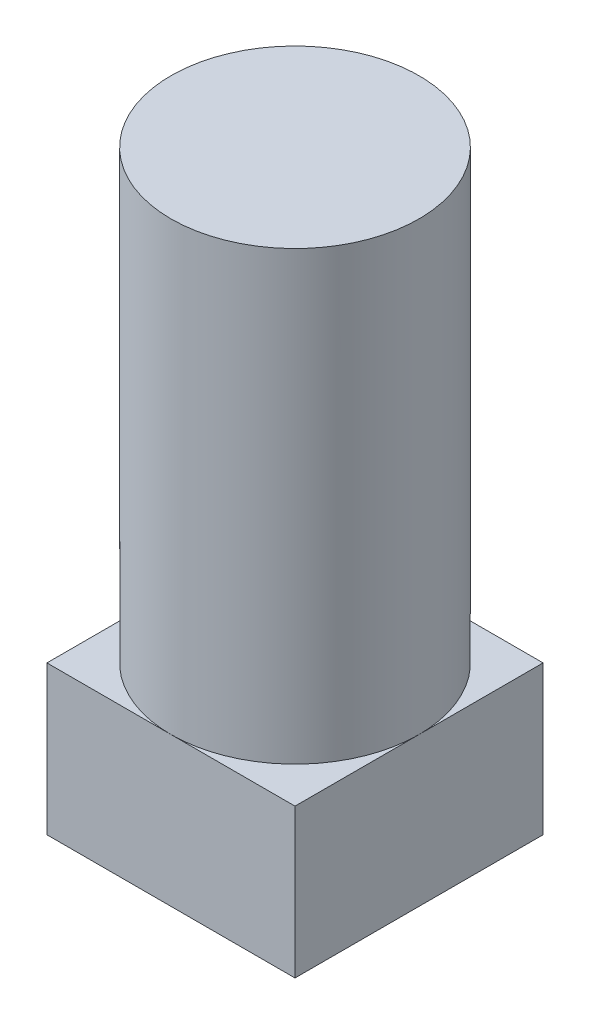
ISO-10303-21;
HEADER;
FILE_DESCRIPTION(('STEP AP214'),'2;1');
FILE_NAME('part.step','',(''),(''),'','','');
FILE_SCHEMA(('AUTOMOTIVE_DESIGN { 1 0 10303 214 1 1 1 1 }'));
ENDSEC;
DATA;
#1=APPLICATION_CONTEXT('core data for automotive mechanical design processes');
#2=APPLICATION_PROTOCOL_DEFINITION('international standard','automotive_design',2000,#1);
#3=PRODUCT_CONTEXT('',#1,'mechanical');
#4=PRODUCT('Part','Part','',(#3));
#5=PRODUCT_RELATED_PRODUCT_CATEGORY('part','',(#4));
#6=PRODUCT_DEFINITION_FORMATION('','',#4);
#7=PRODUCT_DEFINITION_CONTEXT('part definition',#1,'design');
#8=PRODUCT_DEFINITION('design','',#6,#7);
#9=PRODUCT_DEFINITION_SHAPE('','',#8);
#10=(LENGTH_UNIT() NAMED_UNIT(*) SI_UNIT(.MILLI.,.METRE.));
#11=(NAMED_UNIT(*) PLANE_ANGLE_UNIT() SI_UNIT($,.RADIAN.));
#12=(NAMED_UNIT(*) SI_UNIT($,.STERADIAN.) SOLID_ANGLE_UNIT());
#13=UNCERTAINTY_MEASURE_WITH_UNIT(LENGTH_MEASURE(1.E-05),#10,'distance_accuracy_value','');
#14=(GEOMETRIC_REPRESENTATION_CONTEXT(3) GLOBAL_UNCERTAINTY_ASSIGNED_CONTEXT((#13)) GLOBAL_UNIT_ASSIGNED_CONTEXT((#10,
#11,#12)) REPRESENTATION_CONTEXT('',''));
#15=CARTESIAN_POINT('',(0.,0.,0.));
#16=DIRECTION('',(0.,0.,1.));
#17=DIRECTION('',(1.,0.,0.));
#18=AXIS2_PLACEMENT_3D('',#15,#16,#17);
#19=CARTESIAN_POINT('',(0.,152.4,0.));
#20=DIRECTION('',(0.,1.,0.));
#21=DIRECTION('',(0.,0.,1.));
#22=AXIS2_PLACEMENT_3D('',#19,#20,#21);
#23=PLANE('',#22);
#24=CARTESIAN_POINT('',(0.,152.4,0.));
#25=DIRECTION('',(0.,1.,0.));
#26=DIRECTION('',(0.,0.,1.));
#27=AXIS2_PLACEMENT_3D('',#24,#25,#26);
#28=CIRCLE('',#27,127.);
#29=CARTESIAN_POINT('',(0.,152.4,127.));
#30=VERTEX_POINT('',#29);
#31=CARTESIAN_POINT('',(127.,152.4,0.));
#32=VERTEX_POINT('',#31);
#33=EDGE_CURVE('E44',#30,#32,#28,.T.);
#34=ORIENTED_EDGE('',*,*,#33,.F.);
#35=DIRECTION('',(1.,0.,0.));
#36=VECTOR('',#35,1.);
#37=CARTESIAN_POINT('',(-127.,152.4,127.));
#38=LINE('',#37,#36);
#39=CARTESIAN_POINT('',(127.,152.4,127.));
#40=VERTEX_POINT('',#39);
#41=EDGE_CURVE('E94',#30,#40,#38,.T.);
#42=ORIENTED_EDGE('',*,*,#41,.T.);
#43=DIRECTION('',(0.,0.,-1.));
#44=VECTOR('',#43,1.);
#45=CARTESIAN_POINT('',(127.,152.4,127.));
#46=LINE('',#45,#44);
#47=EDGE_CURVE('E104',#40,#32,#46,.T.);
#48=ORIENTED_EDGE('',*,*,#47,.T.);
#49=EDGE_LOOP('',(#34,#42,#48));
#50=FACE_BOUND('',#49,.T.);
#51=ADVANCED_FACE('F33',(#50),#23,.T.);
#52=CARTESIAN_POINT('',(0.,152.4,-127.));
#53=VERTEX_POINT('',#52);
#54=EDGE_CURVE('E11',#32,#53,#28,.T.);
#55=ORIENTED_EDGE('',*,*,#54,.F.);
#56=CARTESIAN_POINT('',(127.,152.4,-127.));
#57=VERTEX_POINT('',#56);
#58=EDGE_CURVE('E118',#32,#57,#46,.T.);
#59=ORIENTED_EDGE('',*,*,#58,.T.);
#60=DIRECTION('',(1.,0.,0.));
#61=VECTOR('',#60,1.);
#62=CARTESIAN_POINT('',(-127.,152.4,-127.));
#63=LINE('',#62,#61);
#64=EDGE_CURVE('E119',#53,#57,#63,.T.);
#65=ORIENTED_EDGE('',*,*,#64,.F.);
#66=EDGE_LOOP('',(#55,#59,#65));
#67=FACE_BOUND('',#66,.T.);
#68=ADVANCED_FACE('F150',(#67),#23,.T.);
#69=CARTESIAN_POINT('',(-127.,152.4,0.));
#70=VERTEX_POINT('',#69);
#71=EDGE_CURVE('E42',#53,#70,#28,.T.);
#72=ORIENTED_EDGE('',*,*,#71,.F.);
#73=CARTESIAN_POINT('',(-127.,152.4,-127.));
#74=VERTEX_POINT('',#73);
#75=EDGE_CURVE('E115',#74,#53,#63,.T.);
#76=ORIENTED_EDGE('',*,*,#75,.F.);
#77=DIRECTION('',(0.,0.,-1.));
#78=VECTOR('',#77,1.);
#79=CARTESIAN_POINT('',(-127.,152.4,127.));
#80=LINE('',#79,#78);
#81=EDGE_CURVE('E93',#70,#74,#80,.T.);
#82=ORIENTED_EDGE('',*,*,#81,.F.);
#83=EDGE_LOOP('',(#72,#76,#82));
#84=FACE_BOUND('',#83,.T.);
#85=ADVANCED_FACE('F149',(#84),#23,.T.);
#86=CARTESIAN_POINT('',(-127.,152.4,-127.));
#87=DIRECTION('',(0.,0.,-1.));
#88=DIRECTION('',(-1.,0.,0.));
#89=AXIS2_PLACEMENT_3D('',#86,#87,#88);
#90=PLANE('',#89);
#91=DIRECTION('',(1.,0.,0.));
#92=VECTOR('',#91,1.);
#93=CARTESIAN_POINT('',(-127.,0.,-127.));
#94=LINE('',#93,#92);
#95=CARTESIAN_POINT('',(-127.,0.,-127.));
#96=VERTEX_POINT('',#95);
#97=CARTESIAN_POINT('',(127.,0.,-127.));
#98=VERTEX_POINT('',#97);
#99=EDGE_CURVE('E122',#96,#98,#94,.T.);
#100=ORIENTED_EDGE('',*,*,#99,.F.);
#101=DIRECTION('',(0.,-1.,0.));
#102=VECTOR('',#101,1.);
#103=CARTESIAN_POINT('',(-127.,152.4,-127.));
#104=LINE('',#103,#102);
#105=EDGE_CURVE('E110',#74,#96,#104,.T.);
#106=ORIENTED_EDGE('',*,*,#105,.F.);
#107=ORIENTED_EDGE('',*,*,#75,.T.);
#108=ORIENTED_EDGE('',*,*,#64,.T.);
#109=DIRECTION('',(0.,-1.,0.));
#110=VECTOR('',#109,1.);
#111=CARTESIAN_POINT('',(127.,152.4,-127.));
#112=LINE('',#111,#110);
#113=EDGE_CURVE('E37',#57,#98,#112,.T.);
#114=ORIENTED_EDGE('',*,*,#113,.T.);
#115=EDGE_LOOP('',(#100,#106,#107,#108,#114));
#116=FACE_BOUND('',#115,.T.);
#117=ADVANCED_FACE('F35',(#116),#90,.T.);
#118=CARTESIAN_POINT('',(-127.,152.4,127.));
#119=DIRECTION('',(-1.,0.,0.));
#120=DIRECTION('',(0.,0.,1.));
#121=AXIS2_PLACEMENT_3D('',#118,#119,#120);
#122=PLANE('',#121);
#123=DIRECTION('',(0.,0.,-1.));
#124=VECTOR('',#123,1.);
#125=CARTESIAN_POINT('',(-127.,0.,127.));
#126=LINE('',#125,#124);
#127=CARTESIAN_POINT('',(-127.,0.,127.));
#128=VERTEX_POINT('',#127);
#129=EDGE_CURVE('E130',#128,#96,#126,.T.);
#130=ORIENTED_EDGE('',*,*,#129,.F.);
#131=DIRECTION('',(0.,-1.,0.));
#132=VECTOR('',#131,1.);
#133=CARTESIAN_POINT('',(-127.,152.4,127.));
#134=LINE('',#133,#132);
#135=CARTESIAN_POINT('',(-127.,152.4,127.));
#136=VERTEX_POINT('',#135);
#137=EDGE_CURVE('E111',#136,#128,#134,.T.);
#138=ORIENTED_EDGE('',*,*,#137,.F.);
#139=EDGE_CURVE('E91',#136,#70,#80,.T.);
#140=ORIENTED_EDGE('',*,*,#139,.T.);
#141=ORIENTED_EDGE('',*,*,#81,.T.);
#142=ORIENTED_EDGE('',*,*,#105,.T.);
#143=EDGE_LOOP('',(#130,#138,#140,#141,#142));
#144=FACE_BOUND('',#143,.T.);
#145=ADVANCED_FACE('F146',(#144),#122,.T.);
#146=CARTESIAN_POINT('',(-127.,152.4,127.));
#147=DIRECTION('',(0.,0.,-1.));
#148=DIRECTION('',(-1.,0.,0.));
#149=AXIS2_PLACEMENT_3D('',#146,#147,#148);
#150=PLANE('',#149);
#151=DIRECTION('',(1.,0.,0.));
#152=VECTOR('',#151,1.);
#153=CARTESIAN_POINT('',(-127.,0.,127.));
#154=LINE('',#153,#152);
#155=CARTESIAN_POINT('',(127.,0.,127.));
#156=VERTEX_POINT('',#155);
#157=EDGE_CURVE('E128',#128,#156,#154,.T.);
#158=ORIENTED_EDGE('',*,*,#157,.T.);
#159=DIRECTION('',(0.,-1.,0.));
#160=VECTOR('',#159,1.);
#161=CARTESIAN_POINT('',(127.,152.4,127.));
#162=LINE('',#161,#160);
#163=EDGE_CURVE('E100',#40,#156,#162,.T.);
#164=ORIENTED_EDGE('',*,*,#163,.F.);
#165=ORIENTED_EDGE('',*,*,#41,.F.);
#166=EDGE_CURVE('E87',#136,#30,#38,.T.);
#167=ORIENTED_EDGE('',*,*,#166,.F.);
#168=ORIENTED_EDGE('',*,*,#137,.T.);
#169=EDGE_LOOP('',(#158,#164,#165,#167,#168));
#170=FACE_BOUND('',#169,.T.);
#171=ADVANCED_FACE('F98',(#170),#150,.F.);
#172=CARTESIAN_POINT('',(127.,152.4,127.));
#173=DIRECTION('',(-1.,0.,0.));
#174=DIRECTION('',(0.,0.,1.));
#175=AXIS2_PLACEMENT_3D('',#172,#173,#174);
#176=PLANE('',#175);
#177=DIRECTION('',(0.,0.,-1.));
#178=VECTOR('',#177,1.);
#179=CARTESIAN_POINT('',(127.,0.,127.));
#180=LINE('',#179,#178);
#181=EDGE_CURVE('E125',#156,#98,#180,.T.);
#182=ORIENTED_EDGE('',*,*,#181,.T.);
#183=ORIENTED_EDGE('',*,*,#113,.F.);
#184=ORIENTED_EDGE('',*,*,#58,.F.);
#185=ORIENTED_EDGE('',*,*,#47,.F.);
#186=ORIENTED_EDGE('',*,*,#163,.T.);
#187=EDGE_LOOP('',(#182,#183,#184,#185,#186));
#188=FACE_BOUND('',#187,.T.);
#189=ADVANCED_FACE('F140',(#188),#176,.F.);
#190=EDGE_CURVE('E57',#70,#30,#28,.T.);
#191=ORIENTED_EDGE('',*,*,#190,.F.);
#192=ORIENTED_EDGE('',*,*,#139,.F.);
#193=ORIENTED_EDGE('',*,*,#166,.T.);
#194=EDGE_LOOP('',(#191,#192,#193));
#195=FACE_BOUND('',#194,.T.);
#196=ADVANCED_FACE('F89',(#195),#23,.T.);
#197=CARTESIAN_POINT('',(0.,0.,0.));
#198=DIRECTION('',(0.,1.,0.));
#199=DIRECTION('',(0.,0.,1.));
#200=AXIS2_PLACEMENT_3D('',#197,#198,#199);
#201=PLANE('',#200);
#202=ORIENTED_EDGE('',*,*,#99,.T.);
#203=ORIENTED_EDGE('',*,*,#181,.F.);
#204=ORIENTED_EDGE('',*,*,#157,.F.);
#205=ORIENTED_EDGE('',*,*,#129,.T.);
#206=EDGE_LOOP('',(#202,#203,#204,#205));
#207=FACE_BOUND('',#206,.T.);
#208=ADVANCED_FACE('F143',(#207),#201,.F.);
#209=CARTESIAN_POINT('',(0.,609.6,0.));
#210=DIRECTION('',(0.,-1.,0.));
#211=DIRECTION('',(0.,0.,-1.));
#212=AXIS2_PLACEMENT_3D('',#209,#210,#211);
#213=CYLINDRICAL_SURFACE('',#212,127.);
#214=CARTESIAN_POINT('',(0.,609.6,0.));
#215=DIRECTION('',(0.,1.,0.));
#216=DIRECTION('',(0.,0.,1.));
#217=AXIS2_PLACEMENT_3D('',#214,#215,#216);
#218=CIRCLE('',#217,127.);
#219=CARTESIAN_POINT('',(0.,609.6,127.));
#220=VERTEX_POINT('',#219);
#221=EDGE_CURVE('E107',#220,#220,#218,.T.);
#222=ORIENTED_EDGE('',*,*,#221,.F.);
#223=EDGE_LOOP('',(#222));
#224=FACE_BOUND('',#223,.T.);
#225=ORIENTED_EDGE('',*,*,#33,.T.);
#226=ORIENTED_EDGE('',*,*,#54,.T.);
#227=ORIENTED_EDGE('',*,*,#71,.T.);
#228=ORIENTED_EDGE('',*,*,#190,.T.);
#229=EDGE_LOOP('',(#225,#226,#227,#228));
#230=FACE_BOUND('',#229,.T.);
#231=ADVANCED_FACE('F109',(#224,#230),#213,.T.);
#232=CARTESIAN_POINT('',(0.,609.6,0.));
#233=DIRECTION('',(0.,1.,0.));
#234=DIRECTION('',(0.,0.,1.));
#235=AXIS2_PLACEMENT_3D('',#232,#233,#234);
#236=PLANE('',#235);
#237=ORIENTED_EDGE('',*,*,#221,.T.);
#238=EDGE_LOOP('',(#237));
#239=FACE_BOUND('',#238,.T.);
#240=ADVANCED_FACE('F186',(#239),#236,.T.);
#241=CLOSED_SHELL('',(#51,#68,#85,#117,#145,#171,#189,#196,#208,#231,#240));
#242=MANIFOLD_SOLID_BREP('B2',#241);
#243=ADVANCED_BREP_SHAPE_REPRESENTATION('',(#18,#242),#14);
#244=SHAPE_DEFINITION_REPRESENTATION(#9,#243);
ENDSEC;
END-ISO-10303-21;
